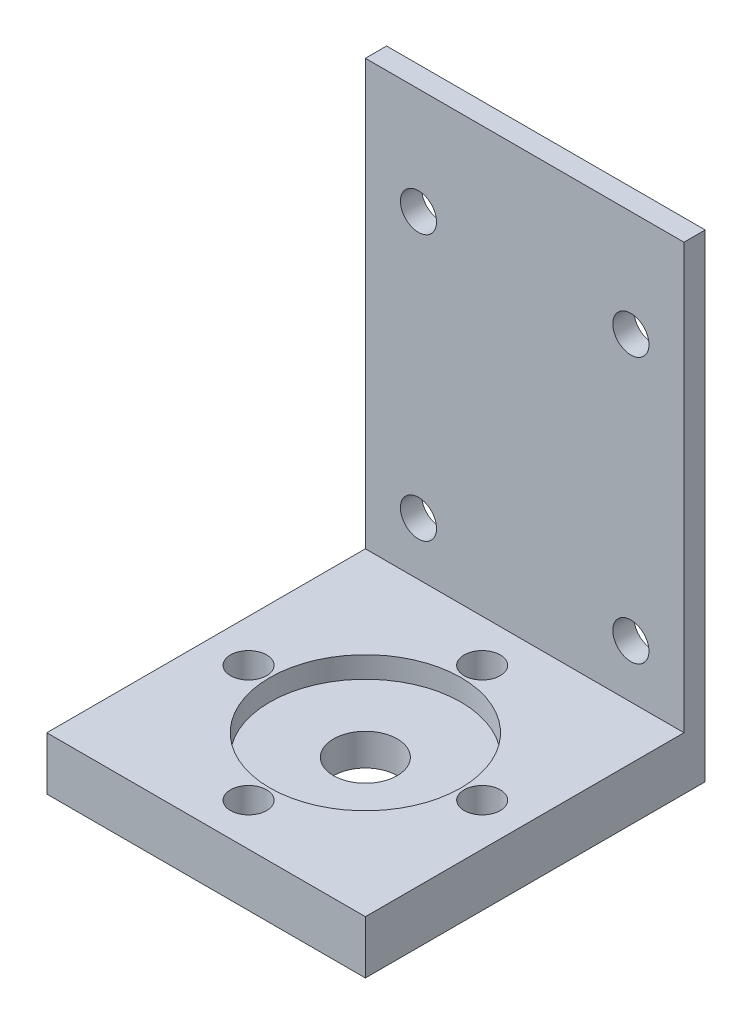
ISO-10303-21;
HEADER;
FILE_DESCRIPTION(('STEP AP214'),'2;1');
FILE_NAME('part.step','',(''),(''),'','','');
FILE_SCHEMA(('AUTOMOTIVE_DESIGN { 1 0 10303 214 1 1 1 1 }'));
ENDSEC;
DATA;
#1=APPLICATION_CONTEXT('core data for automotive mechanical design processes');
#2=APPLICATION_PROTOCOL_DEFINITION('international standard','automotive_design',2000,#1);
#3=PRODUCT_CONTEXT('',#1,'mechanical');
#4=PRODUCT('Part','Part','',(#3));
#5=PRODUCT_RELATED_PRODUCT_CATEGORY('part','',(#4));
#6=PRODUCT_DEFINITION_FORMATION('','',#4);
#7=PRODUCT_DEFINITION_CONTEXT('part definition',#1,'design');
#8=PRODUCT_DEFINITION('design','',#6,#7);
#9=PRODUCT_DEFINITION_SHAPE('','',#8);
#10=(LENGTH_UNIT() NAMED_UNIT(*) SI_UNIT(.MILLI.,.METRE.));
#11=(NAMED_UNIT(*) PLANE_ANGLE_UNIT() SI_UNIT($,.RADIAN.));
#12=(NAMED_UNIT(*) SI_UNIT($,.STERADIAN.) SOLID_ANGLE_UNIT());
#13=UNCERTAINTY_MEASURE_WITH_UNIT(LENGTH_MEASURE(1.E-05),#10,'distance_accuracy_value','');
#14=(GEOMETRIC_REPRESENTATION_CONTEXT(3) GLOBAL_UNCERTAINTY_ASSIGNED_CONTEXT((#13)) GLOBAL_UNIT_ASSIGNED_CONTEXT((#10,
#11,#12)) REPRESENTATION_CONTEXT('',''));
#15=CARTESIAN_POINT('',(0.,0.,0.));
#16=DIRECTION('',(0.,0.,1.));
#17=DIRECTION('',(1.,0.,0.));
#18=AXIS2_PLACEMENT_3D('',#15,#16,#17);
#19=CARTESIAN_POINT('',(30.,5.,0.));
#20=DIRECTION('',(0.,0.,-1.));
#21=DIRECTION('',(0.,1.,0.));
#22=AXIS2_PLACEMENT_3D('',#19,#20,#21);
#23=PLANE('',#22);
#24=DIRECTION('',(0.,-1.,0.));
#25=VECTOR('',#24,1.);
#26=CARTESIAN_POINT('',(0.,5.,0.));
#27=LINE('',#26,#25);
#28=CARTESIAN_POINT('',(0.,5.,0.));
#29=VERTEX_POINT('',#28);
#30=CARTESIAN_POINT('',(0.,0.,0.));
#31=VERTEX_POINT('',#30);
#32=EDGE_CURVE('E150',#29,#31,#27,.T.);
#33=ORIENTED_EDGE('',*,*,#32,.T.);
#34=DIRECTION('',(-1.,0.,0.));
#35=VECTOR('',#34,1.);
#36=CARTESIAN_POINT('',(30.,0.,0.));
#37=LINE('',#36,#35);
#38=CARTESIAN_POINT('',(30.,0.,0.));
#39=VERTEX_POINT('',#38);
#40=EDGE_CURVE('E13',#39,#31,#37,.T.);
#41=ORIENTED_EDGE('',*,*,#40,.F.);
#42=DIRECTION('',(0.,-1.,0.));
#43=VECTOR('',#42,1.);
#44=CARTESIAN_POINT('',(30.,5.,0.));
#45=LINE('',#44,#43);
#46=CARTESIAN_POINT('',(30.,5.,0.));
#47=VERTEX_POINT('',#46);
#48=EDGE_CURVE('E167',#47,#39,#45,.T.);
#49=ORIENTED_EDGE('',*,*,#48,.F.);
#50=DIRECTION('',(-1.,0.,0.));
#51=VECTOR('',#50,1.);
#52=CARTESIAN_POINT('',(30.,5.,0.));
#53=LINE('',#52,#51);
#54=EDGE_CURVE('E146',#47,#29,#53,.T.);
#55=ORIENTED_EDGE('',*,*,#54,.T.);
#56=EDGE_LOOP('',(#33,#41,#49,#55));
#57=FACE_BOUND('',#56,.T.);
#58=ADVANCED_FACE('F59',(#57),#23,.F.);
#59=CARTESIAN_POINT('',(30.,0.,0.));
#60=DIRECTION('',(0.,1.,0.));
#61=DIRECTION('',(0.,0.,1.));
#62=AXIS2_PLACEMENT_3D('',#59,#60,#61);
#63=PLANE('',#62);
#64=CARTESIAN_POINT('',(4.,0.,-15.));
#65=DIRECTION('',(0.,1.,0.));
#66=DIRECTION('',(0.,0.,1.));
#67=AXIS2_PLACEMENT_3D('',#64,#65,#66);
#68=CIRCLE('',#67,1.7);
#69=CARTESIAN_POINT('',(4.,0.,-13.3));
#70=VERTEX_POINT('',#69);
#71=EDGE_CURVE('E371',#70,#70,#68,.T.);
#72=ORIENTED_EDGE('',*,*,#71,.T.);
#73=EDGE_LOOP('',(#72));
#74=FACE_BOUND('',#73,.T.);
#75=CARTESIAN_POINT('',(15.,0.,-26.));
#76=DIRECTION('',(0.,1.,0.));
#77=DIRECTION('',(0.,0.,1.));
#78=AXIS2_PLACEMENT_3D('',#75,#76,#77);
#79=CIRCLE('',#78,1.7);
#80=CARTESIAN_POINT('',(15.,0.,-24.3));
#81=VERTEX_POINT('',#80);
#82=EDGE_CURVE('E375',#81,#81,#79,.T.);
#83=ORIENTED_EDGE('',*,*,#82,.T.);
#84=EDGE_LOOP('',(#83));
#85=FACE_BOUND('',#84,.T.);
#86=CARTESIAN_POINT('',(26.,0.,-15.));
#87=DIRECTION('',(0.,1.,0.));
#88=DIRECTION('',(0.,0.,1.));
#89=AXIS2_PLACEMENT_3D('',#86,#87,#88);
#90=CIRCLE('',#89,1.7);
#91=CARTESIAN_POINT('',(26.,0.,-13.3));
#92=VERTEX_POINT('',#91);
#93=EDGE_CURVE('E384',#92,#92,#90,.T.);
#94=ORIENTED_EDGE('',*,*,#93,.T.);
#95=EDGE_LOOP('',(#94));
#96=FACE_BOUND('',#95,.T.);
#97=CARTESIAN_POINT('',(15.,0.,-4.));
#98=DIRECTION('',(0.,1.,0.));
#99=DIRECTION('',(0.,0.,1.));
#100=AXIS2_PLACEMENT_3D('',#97,#98,#99);
#101=CIRCLE('',#100,1.7);
#102=CARTESIAN_POINT('',(15.,0.,-2.3));
#103=VERTEX_POINT('',#102);
#104=EDGE_CURVE('E392',#103,#103,#101,.T.);
#105=ORIENTED_EDGE('',*,*,#104,.T.);
#106=EDGE_LOOP('',(#105));
#107=FACE_BOUND('',#106,.T.);
#108=CARTESIAN_POINT('',(15.,0.,-15.));
#109=DIRECTION('',(0.,1.,0.));
#110=DIRECTION('',(0.,0.,1.));
#111=AXIS2_PLACEMENT_3D('',#108,#109,#110);
#112=CIRCLE('',#111,3.);
#113=CARTESIAN_POINT('',(15.,0.,-12.));
#114=VERTEX_POINT('',#113);
#115=EDGE_CURVE('E379',#114,#114,#112,.T.);
#116=ORIENTED_EDGE('',*,*,#115,.T.);
#117=EDGE_LOOP('',(#116));
#118=FACE_BOUND('',#117,.T.);
#119=DIRECTION('',(0.,0.,-1.));
#120=VECTOR('',#119,1.);
#121=CARTESIAN_POINT('',(0.,0.,0.));
#122=LINE('',#121,#120);
#123=CARTESIAN_POINT('',(0.,0.,-32.));
#124=VERTEX_POINT('',#123);
#125=EDGE_CURVE('E154',#31,#124,#122,.T.);
#126=ORIENTED_EDGE('',*,*,#125,.T.);
#127=DIRECTION('',(-1.,0.,0.));
#128=VECTOR('',#127,1.);
#129=CARTESIAN_POINT('',(30.,0.,-32.));
#130=LINE('',#129,#128);
#131=CARTESIAN_POINT('',(30.,0.,-32.));
#132=VERTEX_POINT('',#131);
#133=EDGE_CURVE('E68',#132,#124,#130,.T.);
#134=ORIENTED_EDGE('',*,*,#133,.F.);
#135=DIRECTION('',(0.,0.,-1.));
#136=VECTOR('',#135,1.);
#137=CARTESIAN_POINT('',(30.,0.,0.));
#138=LINE('',#137,#136);
#139=EDGE_CURVE('E113',#39,#132,#138,.T.);
#140=ORIENTED_EDGE('',*,*,#139,.F.);
#141=ORIENTED_EDGE('',*,*,#40,.T.);
#142=EDGE_LOOP('',(#126,#134,#140,#141));
#143=FACE_BOUND('',#142,.T.);
#144=ADVANCED_FACE('F203',(#74,#85,#96,#107,#118,#143),#63,.F.);
#145=CARTESIAN_POINT('',(30.,0.,-32.));
#146=DIRECTION('',(0.,0.,1.));
#147=DIRECTION('',(0.,-1.,0.));
#148=AXIS2_PLACEMENT_3D('',#145,#146,#147);
#149=PLANE('',#148);
#150=CARTESIAN_POINT('',(5.,10.,-32.));
#151=DIRECTION('',(0.,0.,1.));
#152=DIRECTION('',(1.,0.,0.));
#153=AXIS2_PLACEMENT_3D('',#150,#151,#152);
#154=CIRCLE('',#153,1.7);
#155=CARTESIAN_POINT('',(6.7,10.,-32.));
#156=VERTEX_POINT('',#155);
#157=EDGE_CURVE('E344',#156,#156,#154,.T.);
#158=ORIENTED_EDGE('',*,*,#157,.T.);
#159=EDGE_LOOP('',(#158));
#160=FACE_BOUND('',#159,.T.);
#161=CARTESIAN_POINT('',(25.,10.,-32.));
#162=DIRECTION('',(0.,0.,1.));
#163=DIRECTION('',(1.,0.,0.));
#164=AXIS2_PLACEMENT_3D('',#161,#162,#163);
#165=CIRCLE('',#164,1.7);
#166=CARTESIAN_POINT('',(26.7,10.,-32.));
#167=VERTEX_POINT('',#166);
#168=EDGE_CURVE('E349',#167,#167,#165,.T.);
#169=ORIENTED_EDGE('',*,*,#168,.T.);
#170=EDGE_LOOP('',(#169));
#171=FACE_BOUND('',#170,.T.);
#172=CARTESIAN_POINT('',(25.,35.,-32.));
#173=DIRECTION('',(0.,0.,1.));
#174=DIRECTION('',(1.,0.,0.));
#175=AXIS2_PLACEMENT_3D('',#172,#173,#174);
#176=CIRCLE('',#175,1.7);
#177=CARTESIAN_POINT('',(26.7,35.,-32.));
#178=VERTEX_POINT('',#177);
#179=EDGE_CURVE('E473',#178,#178,#176,.T.);
#180=ORIENTED_EDGE('',*,*,#179,.T.);
#181=EDGE_LOOP('',(#180));
#182=FACE_BOUND('',#181,.T.);
#183=CARTESIAN_POINT('',(5.,35.,-32.));
#184=DIRECTION('',(0.,0.,1.));
#185=DIRECTION('',(1.,0.,0.));
#186=AXIS2_PLACEMENT_3D('',#183,#184,#185);
#187=CIRCLE('',#186,1.7);
#188=CARTESIAN_POINT('',(6.7,35.,-32.));
#189=VERTEX_POINT('',#188);
#190=EDGE_CURVE('E361',#189,#189,#187,.T.);
#191=ORIENTED_EDGE('',*,*,#190,.T.);
#192=EDGE_LOOP('',(#191));
#193=FACE_BOUND('',#192,.T.);
#194=DIRECTION('',(0.,1.,0.));
#195=VECTOR('',#194,1.);
#196=CARTESIAN_POINT('',(0.,0.,-32.));
#197=LINE('',#196,#195);
#198=CARTESIAN_POINT('',(0.,45.,-32.));
#199=VERTEX_POINT('',#198);
#200=EDGE_CURVE('E158',#124,#199,#197,.T.);
#201=ORIENTED_EDGE('',*,*,#200,.T.);
#202=DIRECTION('',(-1.,0.,0.));
#203=VECTOR('',#202,1.);
#204=CARTESIAN_POINT('',(30.,45.,-32.));
#205=LINE('',#204,#203);
#206=CARTESIAN_POINT('',(30.,45.,-32.));
#207=VERTEX_POINT('',#206);
#208=EDGE_CURVE('E137',#207,#199,#205,.T.);
#209=ORIENTED_EDGE('',*,*,#208,.F.);
#210=DIRECTION('',(0.,1.,0.));
#211=VECTOR('',#210,1.);
#212=CARTESIAN_POINT('',(30.,0.,-32.));
#213=LINE('',#212,#211);
#214=EDGE_CURVE('E126',#132,#207,#213,.T.);
#215=ORIENTED_EDGE('',*,*,#214,.F.);
#216=ORIENTED_EDGE('',*,*,#133,.T.);
#217=EDGE_LOOP('',(#201,#209,#215,#216));
#218=FACE_BOUND('',#217,.T.);
#219=ADVANCED_FACE('F179',(#160,#171,#182,#193,#218),#149,.F.);
#220=CARTESIAN_POINT('',(30.,45.,-32.));
#221=DIRECTION('',(0.,-1.,0.));
#222=DIRECTION('',(0.,0.,-1.));
#223=AXIS2_PLACEMENT_3D('',#220,#221,#222);
#224=PLANE('',#223);
#225=DIRECTION('',(0.,0.,1.));
#226=VECTOR('',#225,1.);
#227=CARTESIAN_POINT('',(0.,45.,-32.));
#228=LINE('',#227,#226);
#229=CARTESIAN_POINT('',(0.,45.,-30.));
#230=VERTEX_POINT('',#229);
#231=EDGE_CURVE('E135',#199,#230,#228,.T.);
#232=ORIENTED_EDGE('',*,*,#231,.T.);
#233=DIRECTION('',(-1.,0.,0.));
#234=VECTOR('',#233,1.);
#235=CARTESIAN_POINT('',(30.,45.,-30.));
#236=LINE('',#235,#234);
#237=CARTESIAN_POINT('',(30.,45.,-30.));
#238=VERTEX_POINT('',#237);
#239=EDGE_CURVE('E132',#238,#230,#236,.T.);
#240=ORIENTED_EDGE('',*,*,#239,.F.);
#241=DIRECTION('',(0.,0.,1.));
#242=VECTOR('',#241,1.);
#243=CARTESIAN_POINT('',(30.,45.,-32.));
#244=LINE('',#243,#242);
#245=EDGE_CURVE('E120',#207,#238,#244,.T.);
#246=ORIENTED_EDGE('',*,*,#245,.F.);
#247=ORIENTED_EDGE('',*,*,#208,.T.);
#248=EDGE_LOOP('',(#232,#240,#246,#247));
#249=FACE_BOUND('',#248,.T.);
#250=ADVANCED_FACE('F133',(#249),#224,.F.);
#251=CARTESIAN_POINT('',(30.,45.,-30.));
#252=DIRECTION('',(0.,0.,-1.));
#253=DIRECTION('',(0.,1.,0.));
#254=AXIS2_PLACEMENT_3D('',#251,#252,#253);
#255=PLANE('',#254);
#256=CARTESIAN_POINT('',(5.,10.,-30.));
#257=DIRECTION('',(0.,0.,1.));
#258=DIRECTION('',(1.,0.,0.));
#259=AXIS2_PLACEMENT_3D('',#256,#257,#258);
#260=CIRCLE('',#259,1.7);
#261=CARTESIAN_POINT('',(6.7,10.,-30.));
#262=VERTEX_POINT('',#261);
#263=EDGE_CURVE('E347',#262,#262,#260,.T.);
#264=ORIENTED_EDGE('',*,*,#263,.F.);
#265=EDGE_LOOP('',(#264));
#266=FACE_BOUND('',#265,.T.);
#267=CARTESIAN_POINT('',(25.,10.,-30.));
#268=DIRECTION('',(0.,0.,1.));
#269=DIRECTION('',(1.,0.,0.));
#270=AXIS2_PLACEMENT_3D('',#267,#268,#269);
#271=CIRCLE('',#270,1.7);
#272=CARTESIAN_POINT('',(26.7,10.,-30.));
#273=VERTEX_POINT('',#272);
#274=EDGE_CURVE('E356',#273,#273,#271,.T.);
#275=ORIENTED_EDGE('',*,*,#274,.F.);
#276=EDGE_LOOP('',(#275));
#277=FACE_BOUND('',#276,.T.);
#278=CARTESIAN_POINT('',(25.,35.,-30.));
#279=DIRECTION('',(0.,0.,1.));
#280=DIRECTION('',(1.,0.,0.));
#281=AXIS2_PLACEMENT_3D('',#278,#279,#280);
#282=CIRCLE('',#281,1.7);
#283=CARTESIAN_POINT('',(26.7,35.,-30.));
#284=VERTEX_POINT('',#283);
#285=EDGE_CURVE('E370',#284,#284,#282,.T.);
#286=ORIENTED_EDGE('',*,*,#285,.F.);
#287=EDGE_LOOP('',(#286));
#288=FACE_BOUND('',#287,.T.);
#289=CARTESIAN_POINT('',(5.,35.,-30.));
#290=DIRECTION('',(0.,0.,1.));
#291=DIRECTION('',(1.,0.,0.));
#292=AXIS2_PLACEMENT_3D('',#289,#290,#291);
#293=CIRCLE('',#292,1.7);
#294=CARTESIAN_POINT('',(6.7,35.,-30.));
#295=VERTEX_POINT('',#294);
#296=EDGE_CURVE('E366',#295,#295,#293,.T.);
#297=ORIENTED_EDGE('',*,*,#296,.F.);
#298=EDGE_LOOP('',(#297));
#299=FACE_BOUND('',#298,.T.);
#300=DIRECTION('',(0.,-1.,0.));
#301=VECTOR('',#300,1.);
#302=CARTESIAN_POINT('',(0.,45.,-30.));
#303=LINE('',#302,#301);
#304=CARTESIAN_POINT('',(0.,5.,-30.));
#305=VERTEX_POINT('',#304);
#306=EDGE_CURVE('E99',#230,#305,#303,.T.);
#307=ORIENTED_EDGE('',*,*,#306,.T.);
#308=DIRECTION('',(-1.,0.,0.));
#309=VECTOR('',#308,1.);
#310=CARTESIAN_POINT('',(30.,5.,-30.));
#311=LINE('',#310,#309);
#312=CARTESIAN_POINT('',(30.,5.,-30.));
#313=VERTEX_POINT('',#312);
#314=EDGE_CURVE('E138',#313,#305,#311,.T.);
#315=ORIENTED_EDGE('',*,*,#314,.F.);
#316=DIRECTION('',(0.,-1.,0.));
#317=VECTOR('',#316,1.);
#318=CARTESIAN_POINT('',(30.,45.,-30.));
#319=LINE('',#318,#317);
#320=EDGE_CURVE('E124',#238,#313,#319,.T.);
#321=ORIENTED_EDGE('',*,*,#320,.F.);
#322=ORIENTED_EDGE('',*,*,#239,.T.);
#323=EDGE_LOOP('',(#307,#315,#321,#322));
#324=FACE_BOUND('',#323,.T.);
#325=ADVANCED_FACE('F140',(#266,#277,#288,#299,#324),#255,.F.);
#326=CARTESIAN_POINT('',(30.,5.,-30.));
#327=DIRECTION('',(0.,-1.,0.));
#328=DIRECTION('',(0.,0.,-1.));
#329=AXIS2_PLACEMENT_3D('',#326,#327,#328);
#330=PLANE('',#329);
#331=CARTESIAN_POINT('',(4.,5.,-15.));
#332=DIRECTION('',(0.,1.,0.));
#333=DIRECTION('',(0.,0.,1.));
#334=AXIS2_PLACEMENT_3D('',#331,#332,#333);
#335=CIRCLE('',#334,1.7);
#336=CARTESIAN_POINT('',(4.,5.,-13.3));
#337=VERTEX_POINT('',#336);
#338=EDGE_CURVE('E374',#337,#337,#335,.T.);
#339=ORIENTED_EDGE('',*,*,#338,.F.);
#340=EDGE_LOOP('',(#339));
#341=FACE_BOUND('',#340,.T.);
#342=CARTESIAN_POINT('',(15.,5.,-26.));
#343=DIRECTION('',(0.,1.,0.));
#344=DIRECTION('',(0.,0.,1.));
#345=AXIS2_PLACEMENT_3D('',#342,#343,#344);
#346=CIRCLE('',#345,1.7);
#347=CARTESIAN_POINT('',(15.,5.,-24.3));
#348=VERTEX_POINT('',#347);
#349=EDGE_CURVE('E380',#348,#348,#346,.T.);
#350=ORIENTED_EDGE('',*,*,#349,.F.);
#351=EDGE_LOOP('',(#350));
#352=FACE_BOUND('',#351,.T.);
#353=CARTESIAN_POINT('',(26.,5.,-15.));
#354=DIRECTION('',(0.,1.,0.));
#355=DIRECTION('',(0.,0.,1.));
#356=AXIS2_PLACEMENT_3D('',#353,#354,#355);
#357=CIRCLE('',#356,1.7);
#358=CARTESIAN_POINT('',(26.,5.,-13.3));
#359=VERTEX_POINT('',#358);
#360=EDGE_CURVE('E388',#359,#359,#357,.T.);
#361=ORIENTED_EDGE('',*,*,#360,.F.);
#362=EDGE_LOOP('',(#361));
#363=FACE_BOUND('',#362,.T.);
#364=CARTESIAN_POINT('',(15.,5.,-4.));
#365=DIRECTION('',(0.,1.,0.));
#366=DIRECTION('',(0.,0.,1.));
#367=AXIS2_PLACEMENT_3D('',#364,#365,#366);
#368=CIRCLE('',#367,1.7);
#369=CARTESIAN_POINT('',(15.,5.,-2.3));
#370=VERTEX_POINT('',#369);
#371=EDGE_CURVE('E365',#370,#370,#368,.T.);
#372=ORIENTED_EDGE('',*,*,#371,.F.);
#373=EDGE_LOOP('',(#372));
#374=FACE_BOUND('',#373,.T.);
#375=CARTESIAN_POINT('',(15.,5.,-15.));
#376=DIRECTION('',(0.,1.,0.));
#377=DIRECTION('',(0.,0.,1.));
#378=AXIS2_PLACEMENT_3D('',#375,#376,#377);
#379=CIRCLE('',#378,9.);
#380=CARTESIAN_POINT('',(15.,5.,-6.));
#381=VERTEX_POINT('',#380);
#382=EDGE_CURVE('E409',#381,#381,#379,.T.);
#383=ORIENTED_EDGE('',*,*,#382,.F.);
#384=EDGE_LOOP('',(#383));
#385=FACE_BOUND('',#384,.T.);
#386=DIRECTION('',(0.,0.,1.));
#387=VECTOR('',#386,1.);
#388=CARTESIAN_POINT('',(0.,5.,-30.));
#389=LINE('',#388,#387);
#390=EDGE_CURVE('E105',#305,#29,#389,.T.);
#391=ORIENTED_EDGE('',*,*,#390,.T.);
#392=ORIENTED_EDGE('',*,*,#54,.F.);
#393=DIRECTION('',(0.,0.,1.));
#394=VECTOR('',#393,1.);
#395=CARTESIAN_POINT('',(30.,5.,-30.));
#396=LINE('',#395,#394);
#397=EDGE_CURVE('E76',#313,#47,#396,.T.);
#398=ORIENTED_EDGE('',*,*,#397,.F.);
#399=ORIENTED_EDGE('',*,*,#314,.T.);
#400=EDGE_LOOP('',(#391,#392,#398,#399));
#401=FACE_BOUND('',#400,.T.);
#402=ADVANCED_FACE('F186',(#341,#352,#363,#374,#385,#401),#330,.F.);
#403=CARTESIAN_POINT('',(30.,0.,0.));
#404=DIRECTION('',(1.,0.,0.));
#405=DIRECTION('',(0.,0.,-1.));
#406=AXIS2_PLACEMENT_3D('',#403,#404,#405);
#407=PLANE('',#406);
#408=ORIENTED_EDGE('',*,*,#48,.T.);
#409=ORIENTED_EDGE('',*,*,#139,.T.);
#410=ORIENTED_EDGE('',*,*,#214,.T.);
#411=ORIENTED_EDGE('',*,*,#245,.T.);
#412=ORIENTED_EDGE('',*,*,#320,.T.);
#413=ORIENTED_EDGE('',*,*,#397,.T.);
#414=EDGE_LOOP('',(#408,#409,#410,#411,#412,#413));
#415=FACE_BOUND('',#414,.T.);
#416=ADVANCED_FACE('F122',(#415),#407,.T.);
#417=CARTESIAN_POINT('',(0.,0.,0.));
#418=DIRECTION('',(1.,0.,0.));
#419=DIRECTION('',(0.,0.,-1.));
#420=AXIS2_PLACEMENT_3D('',#417,#418,#419);
#421=PLANE('',#420);
#422=ORIENTED_EDGE('',*,*,#32,.F.);
#423=ORIENTED_EDGE('',*,*,#390,.F.);
#424=ORIENTED_EDGE('',*,*,#306,.F.);
#425=ORIENTED_EDGE('',*,*,#231,.F.);
#426=ORIENTED_EDGE('',*,*,#200,.F.);
#427=ORIENTED_EDGE('',*,*,#125,.F.);
#428=EDGE_LOOP('',(#422,#423,#424,#425,#426,#427));
#429=FACE_BOUND('',#428,.T.);
#430=ADVANCED_FACE('F182',(#429),#421,.F.);
#431=CARTESIAN_POINT('',(15.,3.,-15.));
#432=DIRECTION('',(0.,1.,0.));
#433=DIRECTION('',(0.,0.,1.));
#434=AXIS2_PLACEMENT_3D('',#431,#432,#433);
#435=CYLINDRICAL_SURFACE('',#434,9.);
#436=CARTESIAN_POINT('',(15.,3.,-15.));
#437=DIRECTION('',(0.,1.,0.));
#438=DIRECTION('',(0.,0.,1.));
#439=AXIS2_PLACEMENT_3D('',#436,#437,#438);
#440=CIRCLE('',#439,9.);
#441=CARTESIAN_POINT('',(15.,3.,-6.));
#442=VERTEX_POINT('',#441);
#443=EDGE_CURVE('E155',#442,#442,#440,.T.);
#444=ORIENTED_EDGE('',*,*,#443,.F.);
#445=EDGE_LOOP('',(#444));
#446=FACE_BOUND('',#445,.T.);
#447=ORIENTED_EDGE('',*,*,#382,.T.);
#448=EDGE_LOOP('',(#447));
#449=FACE_BOUND('',#448,.T.);
#450=ADVANCED_FACE('F233',(#446,#449),#435,.F.);
#451=CARTESIAN_POINT('',(15.,3.,-15.));
#452=DIRECTION('',(0.,1.,0.));
#453=DIRECTION('',(0.,0.,1.));
#454=AXIS2_PLACEMENT_3D('',#451,#452,#453);
#455=PLANE('',#454);
#456=CARTESIAN_POINT('',(15.,3.,-15.));
#457=DIRECTION('',(0.,1.,0.));
#458=DIRECTION('',(0.,0.,1.));
#459=AXIS2_PLACEMENT_3D('',#456,#457,#458);
#460=CIRCLE('',#459,3.);
#461=CARTESIAN_POINT('',(15.,3.,-12.));
#462=VERTEX_POINT('',#461);
#463=EDGE_CURVE('E405',#462,#462,#460,.T.);
#464=ORIENTED_EDGE('',*,*,#463,.F.);
#465=EDGE_LOOP('',(#464));
#466=FACE_BOUND('',#465,.T.);
#467=ORIENTED_EDGE('',*,*,#443,.T.);
#468=EDGE_LOOP('',(#467));
#469=FACE_BOUND('',#468,.T.);
#470=ADVANCED_FACE('F240',(#466,#469),#455,.T.);
#471=CARTESIAN_POINT('',(15.,0.,-15.));
#472=DIRECTION('',(0.,1.,0.));
#473=DIRECTION('',(0.,0.,1.));
#474=AXIS2_PLACEMENT_3D('',#471,#472,#473);
#475=CYLINDRICAL_SURFACE('',#474,3.);
#476=ORIENTED_EDGE('',*,*,#463,.T.);
#477=EDGE_LOOP('',(#476));
#478=FACE_BOUND('',#477,.T.);
#479=ORIENTED_EDGE('',*,*,#115,.F.);
#480=EDGE_LOOP('',(#479));
#481=FACE_BOUND('',#480,.T.);
#482=ADVANCED_FACE('F248',(#478,#481),#475,.F.);
#483=CARTESIAN_POINT('',(15.,5.,-4.));
#484=DIRECTION('',(0.,-1.,0.));
#485=DIRECTION('',(0.,0.,-1.));
#486=AXIS2_PLACEMENT_3D('',#483,#484,#485);
#487=CYLINDRICAL_SURFACE('',#486,1.7);
#488=ORIENTED_EDGE('',*,*,#371,.T.);
#489=EDGE_LOOP('',(#488));
#490=FACE_BOUND('',#489,.T.);
#491=ORIENTED_EDGE('',*,*,#104,.F.);
#492=EDGE_LOOP('',(#491));
#493=FACE_BOUND('',#492,.T.);
#494=ADVANCED_FACE('F256',(#490,#493),#487,.F.);
#495=CARTESIAN_POINT('',(26.,5.,-15.));
#496=DIRECTION('',(0.,-1.,0.));
#497=DIRECTION('',(0.,0.,-1.));
#498=AXIS2_PLACEMENT_3D('',#495,#496,#497);
#499=CYLINDRICAL_SURFACE('',#498,1.7);
#500=ORIENTED_EDGE('',*,*,#360,.T.);
#501=EDGE_LOOP('',(#500));
#502=FACE_BOUND('',#501,.T.);
#503=ORIENTED_EDGE('',*,*,#93,.F.);
#504=EDGE_LOOP('',(#503));
#505=FACE_BOUND('',#504,.T.);
#506=ADVANCED_FACE('F268',(#502,#505),#499,.F.);
#507=CARTESIAN_POINT('',(15.,5.,-26.));
#508=DIRECTION('',(0.,-1.,0.));
#509=DIRECTION('',(0.,0.,-1.));
#510=AXIS2_PLACEMENT_3D('',#507,#508,#509);
#511=CYLINDRICAL_SURFACE('',#510,1.7);
#512=ORIENTED_EDGE('',*,*,#349,.T.);
#513=EDGE_LOOP('',(#512));
#514=FACE_BOUND('',#513,.T.);
#515=ORIENTED_EDGE('',*,*,#82,.F.);
#516=EDGE_LOOP('',(#515));
#517=FACE_BOUND('',#516,.T.);
#518=ADVANCED_FACE('F278',(#514,#517),#511,.F.);
#519=CARTESIAN_POINT('',(4.,5.,-15.));
#520=DIRECTION('',(0.,-1.,0.));
#521=DIRECTION('',(0.,0.,-1.));
#522=AXIS2_PLACEMENT_3D('',#519,#520,#521);
#523=CYLINDRICAL_SURFACE('',#522,1.7);
#524=ORIENTED_EDGE('',*,*,#338,.T.);
#525=EDGE_LOOP('',(#524));
#526=FACE_BOUND('',#525,.T.);
#527=ORIENTED_EDGE('',*,*,#71,.F.);
#528=EDGE_LOOP('',(#527));
#529=FACE_BOUND('',#528,.T.);
#530=ADVANCED_FACE('F288',(#526,#529),#523,.F.);
#531=CARTESIAN_POINT('',(5.,35.,-32.));
#532=DIRECTION('',(0.,0.,1.));
#533=DIRECTION('',(1.,0.,0.));
#534=AXIS2_PLACEMENT_3D('',#531,#532,#533);
#535=CYLINDRICAL_SURFACE('',#534,1.7);
#536=ORIENTED_EDGE('',*,*,#190,.F.);
#537=EDGE_LOOP('',(#536));
#538=FACE_BOUND('',#537,.T.);
#539=ORIENTED_EDGE('',*,*,#296,.T.);
#540=EDGE_LOOP('',(#539));
#541=FACE_BOUND('',#540,.T.);
#542=ADVANCED_FACE('F298',(#538,#541),#535,.F.);
#543=CARTESIAN_POINT('',(25.,35.,-32.));
#544=DIRECTION('',(0.,0.,1.));
#545=DIRECTION('',(1.,0.,0.));
#546=AXIS2_PLACEMENT_3D('',#543,#544,#545);
#547=CYLINDRICAL_SURFACE('',#546,1.7);
#548=ORIENTED_EDGE('',*,*,#179,.F.);
#549=EDGE_LOOP('',(#548));
#550=FACE_BOUND('',#549,.T.);
#551=ORIENTED_EDGE('',*,*,#285,.T.);
#552=EDGE_LOOP('',(#551));
#553=FACE_BOUND('',#552,.T.);
#554=ADVANCED_FACE('F308',(#550,#553),#547,.F.);
#555=CARTESIAN_POINT('',(25.,10.,-32.));
#556=DIRECTION('',(0.,0.,1.));
#557=DIRECTION('',(1.,0.,0.));
#558=AXIS2_PLACEMENT_3D('',#555,#556,#557);
#559=CYLINDRICAL_SURFACE('',#558,1.7);
#560=ORIENTED_EDGE('',*,*,#168,.F.);
#561=EDGE_LOOP('',(#560));
#562=FACE_BOUND('',#561,.T.);
#563=ORIENTED_EDGE('',*,*,#274,.T.);
#564=EDGE_LOOP('',(#563));
#565=FACE_BOUND('',#564,.T.);
#566=ADVANCED_FACE('F318',(#562,#565),#559,.F.);
#567=CARTESIAN_POINT('',(5.,10.,-32.));
#568=DIRECTION('',(0.,0.,1.));
#569=DIRECTION('',(1.,0.,0.));
#570=AXIS2_PLACEMENT_3D('',#567,#568,#569);
#571=CYLINDRICAL_SURFACE('',#570,1.7);
#572=ORIENTED_EDGE('',*,*,#157,.F.);
#573=EDGE_LOOP('',(#572));
#574=FACE_BOUND('',#573,.T.);
#575=ORIENTED_EDGE('',*,*,#263,.T.);
#576=EDGE_LOOP('',(#575));
#577=FACE_BOUND('',#576,.T.);
#578=ADVANCED_FACE('F328',(#574,#577),#571,.F.);
#579=CLOSED_SHELL('',(#58,#144,#219,#250,#325,#402,#416,#430,#450,#470,#482,#494,#506,#518,#530,
#542,#554,#566,#578));
#580=MANIFOLD_SOLID_BREP('B2',#579);
#581=ADVANCED_BREP_SHAPE_REPRESENTATION('',(#18,#580),#14);
#582=SHAPE_DEFINITION_REPRESENTATION(#9,#581);
ENDSEC;
END-ISO-10303-21;
